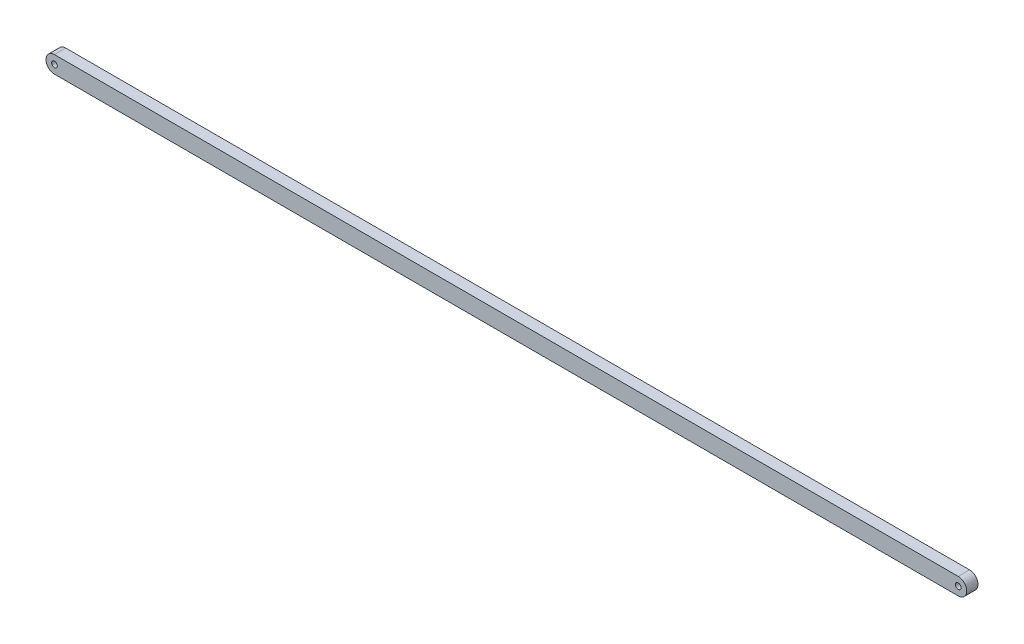
ISO-10303-21;
HEADER;
FILE_DESCRIPTION(('STEP AP214'),'2;1');
FILE_NAME('part.step','',(''),(''),'','','');
FILE_SCHEMA(('AUTOMOTIVE_DESIGN { 1 0 10303 214 1 1 1 1 }'));
ENDSEC;
DATA;
#1=APPLICATION_CONTEXT('core data for automotive mechanical design processes');
#2=APPLICATION_PROTOCOL_DEFINITION('international standard','automotive_design',2000,#1);
#3=PRODUCT_CONTEXT('',#1,'mechanical');
#4=PRODUCT('Part','Part','',(#3));
#5=PRODUCT_RELATED_PRODUCT_CATEGORY('part','',(#4));
#6=PRODUCT_DEFINITION_FORMATION('','',#4);
#7=PRODUCT_DEFINITION_CONTEXT('part definition',#1,'design');
#8=PRODUCT_DEFINITION('design','',#6,#7);
#9=PRODUCT_DEFINITION_SHAPE('','',#8);
#10=(LENGTH_UNIT() NAMED_UNIT(*) SI_UNIT(.MILLI.,.METRE.));
#11=(NAMED_UNIT(*) PLANE_ANGLE_UNIT() SI_UNIT($,.RADIAN.));
#12=(NAMED_UNIT(*) SI_UNIT($,.STERADIAN.) SOLID_ANGLE_UNIT());
#13=UNCERTAINTY_MEASURE_WITH_UNIT(LENGTH_MEASURE(1.E-05),#10,'distance_accuracy_value','');
#14=(GEOMETRIC_REPRESENTATION_CONTEXT(3) GLOBAL_UNCERTAINTY_ASSIGNED_CONTEXT((#13)) GLOBAL_UNIT_ASSIGNED_CONTEXT((#10,
#11,#12)) REPRESENTATION_CONTEXT('',''));
#15=CARTESIAN_POINT('',(0.,0.,0.));
#16=DIRECTION('',(0.,0.,1.));
#17=DIRECTION('',(1.,0.,0.));
#18=AXIS2_PLACEMENT_3D('',#15,#16,#17);
#19=CARTESIAN_POINT('',(0.,0.,2.));
#20=DIRECTION('',(0.,0.,-1.));
#21=DIRECTION('',(-1.,0.,0.));
#22=AXIS2_PLACEMENT_3D('',#19,#20,#21);
#23=CYLINDRICAL_SURFACE('',#22,1.5);
#24=CARTESIAN_POINT('',(0.,0.,0.));
#25=DIRECTION('',(0.,0.,1.));
#26=DIRECTION('',(1.,0.,0.));
#27=AXIS2_PLACEMENT_3D('',#24,#25,#26);
#28=CIRCLE('',#27,1.5);
#29=CARTESIAN_POINT('',(0.,1.5,0.));
#30=VERTEX_POINT('',#29);
#31=CARTESIAN_POINT('',(0.,-1.5,0.));
#32=VERTEX_POINT('',#31);
#33=EDGE_CURVE('E108',#30,#32,#28,.T.);
#34=ORIENTED_EDGE('',*,*,#33,.T.);
#35=DIRECTION('',(0.,0.,-1.));
#36=VECTOR('',#35,1.);
#37=CARTESIAN_POINT('',(0.,-1.5,2.));
#38=LINE('',#37,#36);
#39=CARTESIAN_POINT('',(0.,-1.5,2.));
#40=VERTEX_POINT('',#39);
#41=EDGE_CURVE('E11',#40,#32,#38,.T.);
#42=ORIENTED_EDGE('',*,*,#41,.F.);
#43=CARTESIAN_POINT('',(0.,0.,2.));
#44=DIRECTION('',(0.,0.,1.));
#45=DIRECTION('',(1.,0.,0.));
#46=AXIS2_PLACEMENT_3D('',#43,#44,#45);
#47=CIRCLE('',#46,1.5);
#48=CARTESIAN_POINT('',(0.,1.5,2.));
#49=VERTEX_POINT('',#48);
#50=EDGE_CURVE('E84',#49,#40,#47,.T.);
#51=ORIENTED_EDGE('',*,*,#50,.F.);
#52=DIRECTION('',(0.,0.,-1.));
#53=VECTOR('',#52,1.);
#54=CARTESIAN_POINT('',(0.,1.5,2.));
#55=LINE('',#54,#53);
#56=EDGE_CURVE('E59',#49,#30,#55,.T.);
#57=ORIENTED_EDGE('',*,*,#56,.T.);
#58=EDGE_LOOP('',(#34,#42,#51,#57));
#59=FACE_BOUND('',#58,.T.);
#60=ADVANCED_FACE('F43',(#59),#23,.T.);
#61=CARTESIAN_POINT('',(160.,-1.5,2.));
#62=DIRECTION('',(0.,-1.,0.));
#63=DIRECTION('',(1.,0.,0.));
#64=AXIS2_PLACEMENT_3D('',#61,#62,#63);
#65=PLANE('',#64);
#66=DIRECTION('',(-1.,0.,0.));
#67=VECTOR('',#66,1.);
#68=CARTESIAN_POINT('',(160.,-1.5,0.));
#69=LINE('',#68,#67);
#70=CARTESIAN_POINT('',(160.,-1.5,0.));
#71=VERTEX_POINT('',#70);
#72=EDGE_CURVE('E94',#71,#32,#69,.T.);
#73=ORIENTED_EDGE('',*,*,#72,.F.);
#74=DIRECTION('',(0.,0.,-1.));
#75=VECTOR('',#74,1.);
#76=CARTESIAN_POINT('',(160.,-1.5,2.));
#77=LINE('',#76,#75);
#78=CARTESIAN_POINT('',(160.,-1.5,2.));
#79=VERTEX_POINT('',#78);
#80=EDGE_CURVE('E51',#79,#71,#77,.T.);
#81=ORIENTED_EDGE('',*,*,#80,.F.);
#82=DIRECTION('',(-1.,0.,0.));
#83=VECTOR('',#82,1.);
#84=CARTESIAN_POINT('',(160.,-1.5,2.));
#85=LINE('',#84,#83);
#86=EDGE_CURVE('E92',#79,#40,#85,.T.);
#87=ORIENTED_EDGE('',*,*,#86,.T.);
#88=ORIENTED_EDGE('',*,*,#41,.T.);
#89=EDGE_LOOP('',(#73,#81,#87,#88));
#90=FACE_BOUND('',#89,.T.);
#91=ADVANCED_FACE('F91',(#90),#65,.T.);
#92=CARTESIAN_POINT('',(160.,0.,2.));
#93=DIRECTION('',(0.,0.,-1.));
#94=DIRECTION('',(-1.,0.,0.));
#95=AXIS2_PLACEMENT_3D('',#92,#93,#94);
#96=CYLINDRICAL_SURFACE('',#95,1.5);
#97=CARTESIAN_POINT('',(160.,0.,0.));
#98=DIRECTION('',(0.,0.,1.));
#99=DIRECTION('',(1.,0.,0.));
#100=AXIS2_PLACEMENT_3D('',#97,#98,#99);
#101=CIRCLE('',#100,1.5);
#102=CARTESIAN_POINT('',(160.,1.5,0.));
#103=VERTEX_POINT('',#102);
#104=EDGE_CURVE('E112',#71,#103,#101,.T.);
#105=ORIENTED_EDGE('',*,*,#104,.T.);
#106=DIRECTION('',(0.,0.,-1.));
#107=VECTOR('',#106,1.);
#108=CARTESIAN_POINT('',(160.,1.5,2.));
#109=LINE('',#108,#107);
#110=CARTESIAN_POINT('',(160.,1.5,2.));
#111=VERTEX_POINT('',#110);
#112=EDGE_CURVE('E73',#111,#103,#109,.T.);
#113=ORIENTED_EDGE('',*,*,#112,.F.);
#114=CARTESIAN_POINT('',(160.,0.,2.));
#115=DIRECTION('',(0.,0.,1.));
#116=DIRECTION('',(1.,0.,0.));
#117=AXIS2_PLACEMENT_3D('',#114,#115,#116);
#118=CIRCLE('',#117,1.5);
#119=EDGE_CURVE('E97',#79,#111,#118,.T.);
#120=ORIENTED_EDGE('',*,*,#119,.F.);
#121=ORIENTED_EDGE('',*,*,#80,.T.);
#122=EDGE_LOOP('',(#105,#113,#120,#121));
#123=FACE_BOUND('',#122,.T.);
#124=ADVANCED_FACE('F98',(#123),#96,.T.);
#125=CARTESIAN_POINT('',(0.,1.5,2.));
#126=DIRECTION('',(0.,1.,0.));
#127=DIRECTION('',(-1.,0.,0.));
#128=AXIS2_PLACEMENT_3D('',#125,#126,#127);
#129=PLANE('',#128);
#130=DIRECTION('',(1.,0.,0.));
#131=VECTOR('',#130,1.);
#132=CARTESIAN_POINT('',(0.,1.5,0.));
#133=LINE('',#132,#131);
#134=EDGE_CURVE('E103',#30,#103,#133,.T.);
#135=ORIENTED_EDGE('',*,*,#134,.F.);
#136=ORIENTED_EDGE('',*,*,#56,.F.);
#137=DIRECTION('',(1.,0.,0.));
#138=VECTOR('',#137,1.);
#139=CARTESIAN_POINT('',(0.,1.5,2.));
#140=LINE('',#139,#138);
#141=EDGE_CURVE('E99',#49,#111,#140,.T.);
#142=ORIENTED_EDGE('',*,*,#141,.T.);
#143=ORIENTED_EDGE('',*,*,#112,.T.);
#144=EDGE_LOOP('',(#135,#136,#142,#143));
#145=FACE_BOUND('',#144,.T.);
#146=ADVANCED_FACE('F119',(#145),#129,.T.);
#147=CARTESIAN_POINT('',(0.,0.,2.));
#148=DIRECTION('',(0.,0.,1.));
#149=DIRECTION('',(1.,0.,0.));
#150=AXIS2_PLACEMENT_3D('',#147,#148,#149);
#151=PLANE('',#150);
#152=CARTESIAN_POINT('',(160.,0.,2.));
#153=DIRECTION('',(0.,0.,-1.));
#154=DIRECTION('',(-1.,0.,0.));
#155=AXIS2_PLACEMENT_3D('',#152,#153,#154);
#156=CIRCLE('',#155,0.499999999999999);
#157=CARTESIAN_POINT('',(159.5,0.,2.));
#158=VERTEX_POINT('',#157);
#159=EDGE_CURVE('E110',#158,#158,#156,.T.);
#160=ORIENTED_EDGE('',*,*,#159,.T.);
#161=EDGE_LOOP('',(#160));
#162=FACE_BOUND('',#161,.T.);
#163=CARTESIAN_POINT('',(0.,0.,2.));
#164=DIRECTION('',(0.,0.,-1.));
#165=DIRECTION('',(-1.,0.,0.));
#166=AXIS2_PLACEMENT_3D('',#163,#164,#165);
#167=CIRCLE('',#166,0.5);
#168=CARTESIAN_POINT('',(-0.5,0.,2.));
#169=VERTEX_POINT('',#168);
#170=EDGE_CURVE('E197',#169,#169,#167,.T.);
#171=ORIENTED_EDGE('',*,*,#170,.T.);
#172=EDGE_LOOP('',(#171));
#173=FACE_BOUND('',#172,.T.);
#174=ORIENTED_EDGE('',*,*,#50,.T.);
#175=ORIENTED_EDGE('',*,*,#86,.F.);
#176=ORIENTED_EDGE('',*,*,#119,.T.);
#177=ORIENTED_EDGE('',*,*,#141,.F.);
#178=EDGE_LOOP('',(#174,#175,#176,#177));
#179=FACE_BOUND('',#178,.T.);
#180=ADVANCED_FACE('F101',(#162,#173,#179),#151,.T.);
#181=CARTESIAN_POINT('',(0.,0.,0.));
#182=DIRECTION('',(0.,0.,1.));
#183=DIRECTION('',(1.,0.,0.));
#184=AXIS2_PLACEMENT_3D('',#181,#182,#183);
#185=PLANE('',#184);
#186=CARTESIAN_POINT('',(160.,0.,0.));
#187=DIRECTION('',(0.,0.,-1.));
#188=DIRECTION('',(-1.,0.,0.));
#189=AXIS2_PLACEMENT_3D('',#186,#187,#188);
#190=CIRCLE('',#189,0.499999999999999);
#191=CARTESIAN_POINT('',(159.5,0.,0.));
#192=VERTEX_POINT('',#191);
#193=EDGE_CURVE('E192',#192,#192,#190,.T.);
#194=ORIENTED_EDGE('',*,*,#193,.F.);
#195=EDGE_LOOP('',(#194));
#196=FACE_BOUND('',#195,.T.);
#197=CARTESIAN_POINT('',(0.,0.,0.));
#198=DIRECTION('',(0.,0.,-1.));
#199=DIRECTION('',(-1.,0.,0.));
#200=AXIS2_PLACEMENT_3D('',#197,#198,#199);
#201=CIRCLE('',#200,0.5);
#202=CARTESIAN_POINT('',(-0.5,0.,0.));
#203=VERTEX_POINT('',#202);
#204=EDGE_CURVE('E193',#203,#203,#201,.T.);
#205=ORIENTED_EDGE('',*,*,#204,.F.);
#206=EDGE_LOOP('',(#205));
#207=FACE_BOUND('',#206,.T.);
#208=ORIENTED_EDGE('',*,*,#33,.F.);
#209=ORIENTED_EDGE('',*,*,#134,.T.);
#210=ORIENTED_EDGE('',*,*,#104,.F.);
#211=ORIENTED_EDGE('',*,*,#72,.T.);
#212=EDGE_LOOP('',(#208,#209,#210,#211));
#213=FACE_BOUND('',#212,.T.);
#214=ADVANCED_FACE('F118',(#196,#207,#213),#185,.F.);
#215=CARTESIAN_POINT('',(0.,0.,2.));
#216=DIRECTION('',(0.,0.,-1.));
#217=DIRECTION('',(-1.,0.,0.));
#218=AXIS2_PLACEMENT_3D('',#215,#216,#217);
#219=CYLINDRICAL_SURFACE('',#218,0.5);
#220=ORIENTED_EDGE('',*,*,#170,.F.);
#221=EDGE_LOOP('',(#220));
#222=FACE_BOUND('',#221,.T.);
#223=ORIENTED_EDGE('',*,*,#204,.T.);
#224=EDGE_LOOP('',(#223));
#225=FACE_BOUND('',#224,.T.);
#226=ADVANCED_FACE('F163',(#222,#225),#219,.F.);
#227=CARTESIAN_POINT('',(160.,0.,2.));
#228=DIRECTION('',(0.,0.,-1.));
#229=DIRECTION('',(-1.,0.,0.));
#230=AXIS2_PLACEMENT_3D('',#227,#228,#229);
#231=CYLINDRICAL_SURFACE('',#230,0.499999999999999);
#232=ORIENTED_EDGE('',*,*,#159,.F.);
#233=EDGE_LOOP('',(#232));
#234=FACE_BOUND('',#233,.T.);
#235=ORIENTED_EDGE('',*,*,#193,.T.);
#236=EDGE_LOOP('',(#235));
#237=FACE_BOUND('',#236,.T.);
#238=ADVANCED_FACE('F173',(#234,#237),#231,.F.);
#239=CLOSED_SHELL('',(#60,#91,#124,#146,#180,#214,#226,#238));
#240=MANIFOLD_SOLID_BREP('B2',#239);
#241=ADVANCED_BREP_SHAPE_REPRESENTATION('',(#18,#240),#14);
#242=SHAPE_DEFINITION_REPRESENTATION(#9,#241);
ENDSEC;
END-ISO-10303-21;
